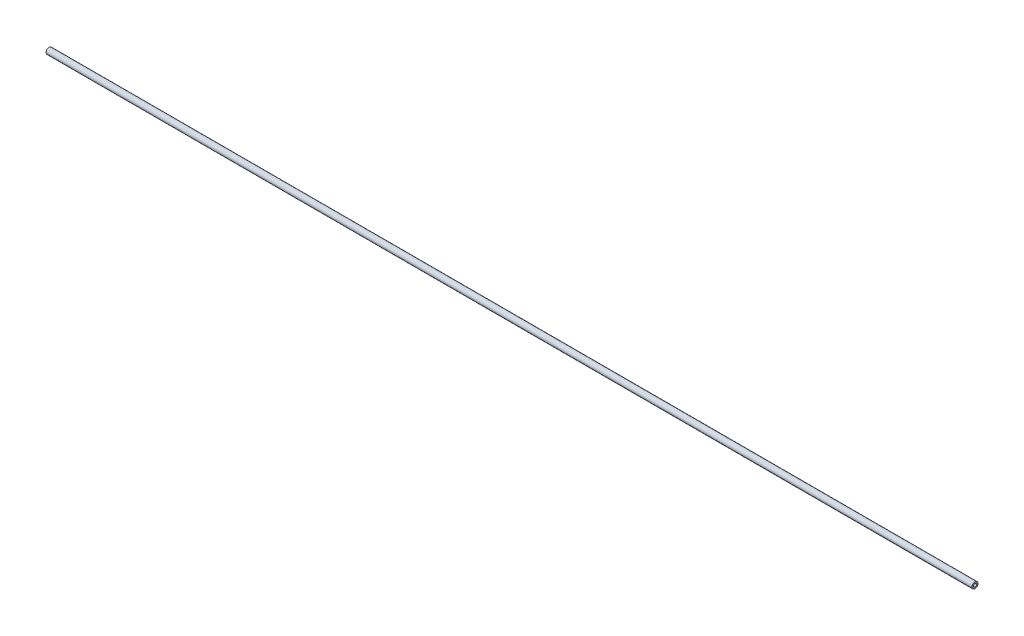
ISO-10303-21;
HEADER;
FILE_DESCRIPTION(('STEP AP214'),'2;1');
FILE_NAME('part.step','',(''),(''),'','','');
FILE_SCHEMA(('AUTOMOTIVE_DESIGN { 1 0 10303 214 1 1 1 1 }'));
ENDSEC;
DATA;
#1=APPLICATION_CONTEXT('core data for automotive mechanical design processes');
#2=APPLICATION_PROTOCOL_DEFINITION('international standard','automotive_design',2000,#1);
#3=PRODUCT_CONTEXT('',#1,'mechanical');
#4=PRODUCT('Part','Part','',(#3));
#5=PRODUCT_RELATED_PRODUCT_CATEGORY('part','',(#4));
#6=PRODUCT_DEFINITION_FORMATION('','',#4);
#7=PRODUCT_DEFINITION_CONTEXT('part definition',#1,'design');
#8=PRODUCT_DEFINITION('design','',#6,#7);
#9=PRODUCT_DEFINITION_SHAPE('','',#8);
#10=(LENGTH_UNIT() NAMED_UNIT(*) SI_UNIT(.MILLI.,.METRE.));
#11=(NAMED_UNIT(*) PLANE_ANGLE_UNIT() SI_UNIT($,.RADIAN.));
#12=(NAMED_UNIT(*) SI_UNIT($,.STERADIAN.) SOLID_ANGLE_UNIT());
#13=UNCERTAINTY_MEASURE_WITH_UNIT(LENGTH_MEASURE(1.E-05),#10,'distance_accuracy_value','');
#14=(GEOMETRIC_REPRESENTATION_CONTEXT(3) GLOBAL_UNCERTAINTY_ASSIGNED_CONTEXT((#13)) GLOBAL_UNIT_ASSIGNED_CONTEXT((#10,
#11,#12)) REPRESENTATION_CONTEXT('',''));
#15=CARTESIAN_POINT('',(0.,0.,0.));
#16=DIRECTION('',(0.,0.,1.));
#17=DIRECTION('',(1.,0.,0.));
#18=AXIS2_PLACEMENT_3D('',#15,#16,#17);
#19=CARTESIAN_POINT('',(152.4,0.,0.));
#20=DIRECTION('',(1.,0.,0.));
#21=DIRECTION('',(0.,0.,-1.));
#22=AXIS2_PLACEMENT_3D('',#19,#20,#21);
#23=PLANE('',#22);
#24=CARTESIAN_POINT('',(152.4,0.,0.));
#25=DIRECTION('',(1.,0.,0.));
#26=DIRECTION('',(0.,0.,-1.));
#27=AXIS2_PLACEMENT_3D('',#24,#25,#26);
#28=CIRCLE('',#27,1.);
#29=CARTESIAN_POINT('',(152.4,0.,1.));
#30=VERTEX_POINT('',#29);
#31=EDGE_CURVE('E10',#30,#30,#28,.T.);
#32=ORIENTED_EDGE('',*,*,#31,.T.);
#33=EDGE_LOOP('',(#32));
#34=FACE_BOUND('',#33,.T.);
#35=CARTESIAN_POINT('',(152.4,0.,0.));
#36=DIRECTION('',(1.,0.,0.));
#37=DIRECTION('',(0.,0.,-1.));
#38=AXIS2_PLACEMENT_3D('',#35,#36,#37);
#39=CIRCLE('',#38,0.5);
#40=CARTESIAN_POINT('',(152.4,0.,-0.5));
#41=VERTEX_POINT('',#40);
#42=EDGE_CURVE('E41',#41,#41,#39,.T.);
#43=ORIENTED_EDGE('',*,*,#42,.F.);
#44=EDGE_LOOP('',(#43));
#45=FACE_BOUND('',#44,.T.);
#46=ADVANCED_FACE('F30',(#34,#45),#23,.T.);
#47=CARTESIAN_POINT('',(-152.4,0.,0.));
#48=DIRECTION('',(1.,0.,0.));
#49=DIRECTION('',(0.,0.,-1.));
#50=AXIS2_PLACEMENT_3D('',#47,#48,#49);
#51=PLANE('',#50);
#52=CARTESIAN_POINT('',(-152.4,0.,0.));
#53=DIRECTION('',(1.,0.,0.));
#54=DIRECTION('',(0.,0.,-1.));
#55=AXIS2_PLACEMENT_3D('',#52,#53,#54);
#56=CIRCLE('',#55,1.);
#57=CARTESIAN_POINT('',(-152.4,0.,1.));
#58=VERTEX_POINT('',#57);
#59=EDGE_CURVE('E34',#58,#58,#56,.T.);
#60=ORIENTED_EDGE('',*,*,#59,.F.);
#61=EDGE_LOOP('',(#60));
#62=FACE_BOUND('',#61,.T.);
#63=CARTESIAN_POINT('',(-152.4,0.,0.));
#64=DIRECTION('',(1.,0.,0.));
#65=DIRECTION('',(0.,0.,-1.));
#66=AXIS2_PLACEMENT_3D('',#63,#64,#65);
#67=CIRCLE('',#66,0.5);
#68=CARTESIAN_POINT('',(-152.4,0.,-0.5));
#69=VERTEX_POINT('',#68);
#70=EDGE_CURVE('E43',#69,#69,#67,.T.);
#71=ORIENTED_EDGE('',*,*,#70,.T.);
#72=EDGE_LOOP('',(#71));
#73=FACE_BOUND('',#72,.T.);
#74=ADVANCED_FACE('F53',(#62,#73),#51,.F.);
#75=CARTESIAN_POINT('',(152.4,0.,0.));
#76=DIRECTION('',(-1.,0.,0.));
#77=DIRECTION('',(0.,0.,1.));
#78=AXIS2_PLACEMENT_3D('',#75,#76,#77);
#79=CYLINDRICAL_SURFACE('',#78,1.);
#80=CARTESIAN_POINT('',(152.4,0.,1.));
#81=CARTESIAN_POINT('',(149.225,0.,1.));
#82=CARTESIAN_POINT('',(146.05,0.,1.));
#83=CARTESIAN_POINT('',(139.7,0.,1.));
#84=CARTESIAN_POINT('',(136.525,0.,1.));
#85=CARTESIAN_POINT('',(130.175,0.,1.));
#86=CARTESIAN_POINT('',(127.,0.,1.));
#87=CARTESIAN_POINT('',(120.65,0.,1.));
#88=CARTESIAN_POINT('',(117.475,0.,1.));
#89=CARTESIAN_POINT('',(111.125,0.,1.));
#90=CARTESIAN_POINT('',(107.95,0.,1.));
#91=CARTESIAN_POINT('',(101.6,0.,1.));
#92=CARTESIAN_POINT('',(98.425,0.,1.));
#93=CARTESIAN_POINT('',(92.075,0.,1.));
#94=CARTESIAN_POINT('',(88.9,0.,1.));
#95=CARTESIAN_POINT('',(82.55,0.,1.));
#96=CARTESIAN_POINT('',(79.375,0.,1.));
#97=CARTESIAN_POINT('',(73.025,0.,1.));
#98=CARTESIAN_POINT('',(69.85,0.,1.));
#99=CARTESIAN_POINT('',(63.5,0.,1.));
#100=CARTESIAN_POINT('',(60.325,0.,1.));
#101=CARTESIAN_POINT('',(53.975,0.,1.));
#102=CARTESIAN_POINT('',(50.8,0.,1.));
#103=CARTESIAN_POINT('',(44.45,0.,1.));
#104=CARTESIAN_POINT('',(41.275,0.,1.));
#105=CARTESIAN_POINT('',(34.925,0.,1.));
#106=CARTESIAN_POINT('',(31.75,0.,1.));
#107=CARTESIAN_POINT('',(25.4,0.,1.));
#108=CARTESIAN_POINT('',(22.225,0.,1.));
#109=CARTESIAN_POINT('',(15.875,0.,1.));
#110=CARTESIAN_POINT('',(12.7,0.,1.));
#111=CARTESIAN_POINT('',(6.34999999999998,0.,1.));
#112=CARTESIAN_POINT('',(3.17499999999997,0.,1.));
#113=CARTESIAN_POINT('',(-3.17500000000003,0.,1.));
#114=CARTESIAN_POINT('',(-6.35000000000003,0.,1.));
#115=CARTESIAN_POINT('',(-12.7,0.,1.));
#116=CARTESIAN_POINT('',(-15.875,0.,1.));
#117=CARTESIAN_POINT('',(-22.225,0.,1.));
#118=CARTESIAN_POINT('',(-25.4,0.,1.));
#119=CARTESIAN_POINT('',(-31.75,0.,1.));
#120=CARTESIAN_POINT('',(-34.925,0.,1.));
#121=CARTESIAN_POINT('',(-41.275,0.,1.));
#122=CARTESIAN_POINT('',(-44.45,0.,1.));
#123=CARTESIAN_POINT('',(-50.8,0.,1.));
#124=CARTESIAN_POINT('',(-53.975,0.,1.));
#125=CARTESIAN_POINT('',(-60.325,0.,1.));
#126=CARTESIAN_POINT('',(-63.5,0.,1.));
#127=CARTESIAN_POINT('',(-69.85,0.,1.));
#128=CARTESIAN_POINT('',(-73.025,0.,1.));
#129=CARTESIAN_POINT('',(-79.375,0.,1.));
#130=CARTESIAN_POINT('',(-82.5500000000001,0.,1.));
#131=CARTESIAN_POINT('',(-88.9,0.,1.));
#132=CARTESIAN_POINT('',(-92.0750000000001,0.,1.));
#133=CARTESIAN_POINT('',(-98.425,0.,1.));
#134=CARTESIAN_POINT('',(-101.6,0.,1.));
#135=CARTESIAN_POINT('',(-107.95,0.,1.));
#136=CARTESIAN_POINT('',(-111.125,0.,1.));
#137=CARTESIAN_POINT('',(-117.475,0.,1.));
#138=CARTESIAN_POINT('',(-120.65,0.,1.));
#139=CARTESIAN_POINT('',(-127.,0.,1.));
#140=CARTESIAN_POINT('',(-130.175,0.,1.));
#141=CARTESIAN_POINT('',(-136.525,0.,1.));
#142=CARTESIAN_POINT('',(-139.7,0.,1.));
#143=CARTESIAN_POINT('',(-146.05,0.,1.));
#144=CARTESIAN_POINT('',(-149.225,0.,1.));
#145=CARTESIAN_POINT('',(-152.4,0.,1.));
#146=B_SPLINE_CURVE_WITH_KNOTS('',3,(#80,#81,#82,#83,#84,#85,#86,#87,#88,#89,#90,#91,#92,#93,
#94,#95,#96,#97,#98,#99,#100,#101,#102,#103,#104,#105,#106,#107,#108,#109,#110,#111,#112,#113,
#114,#115,#116,#117,#118,#119,#120,#121,#122,#123,#124,#125,#126,#127,#128,#129,#130,#131,#132,
#133,#134,#135,#136,#137,#138,#139,#140,#141,#142,#143,#144,#145),.UNSPECIFIED.,.F.,.F.,(4,2,2,
2,2,2,2,2,2,2,2,2,2,2,2,2,2,2,2,2,2,2,2,2,2,2,2,2,2,2,2,2,4),(0.,9.52499999999998,19.05,28.575,
38.1,47.625,57.15,66.675,76.2,85.725,95.25,104.775,114.3,123.825,133.35,142.875,152.4,161.925,
171.45,180.975,190.5,200.025,209.55,219.075,228.6,238.125,247.65,257.175,266.7,276.225,285.75,
295.275,304.8),.UNSPECIFIED.);
#147=EDGE_CURVE('BSEAM32',#30,#58,#146,.T.);
#148=ORIENTED_EDGE('',*,*,#31,.F.);
#149=ORIENTED_EDGE('',*,*,#59,.T.);
#150=ORIENTED_EDGE('',*,*,#147,.T.);
#151=ORIENTED_EDGE('',*,*,#147,.F.);
#152=EDGE_LOOP('',(#148,#150,#149,#151));
#153=FACE_BOUND('',#152,.T.);
#154=ADVANCED_FACE('F32',(#153),#79,.T.);
#155=CARTESIAN_POINT('',(152.4,0.,0.));
#156=DIRECTION('',(-1.,0.,0.));
#157=DIRECTION('',(0.,0.,1.));
#158=AXIS2_PLACEMENT_3D('',#155,#156,#157);
#159=CYLINDRICAL_SURFACE('',#158,0.5);
#160=ORIENTED_EDGE('',*,*,#42,.T.);
#161=EDGE_LOOP('',(#160));
#162=FACE_BOUND('',#161,.T.);
#163=ORIENTED_EDGE('',*,*,#70,.F.);
#164=EDGE_LOOP('',(#163));
#165=FACE_BOUND('',#164,.T.);
#166=ADVANCED_FACE('F49',(#162,#165),#159,.F.);
#167=CLOSED_SHELL('',(#46,#74,#154,#166));
#168=MANIFOLD_SOLID_BREP('B2',#167);
#169=ADVANCED_BREP_SHAPE_REPRESENTATION('',(#18,#168),#14);
#170=SHAPE_DEFINITION_REPRESENTATION(#9,#169);
ENDSEC;
END-ISO-10303-21;
